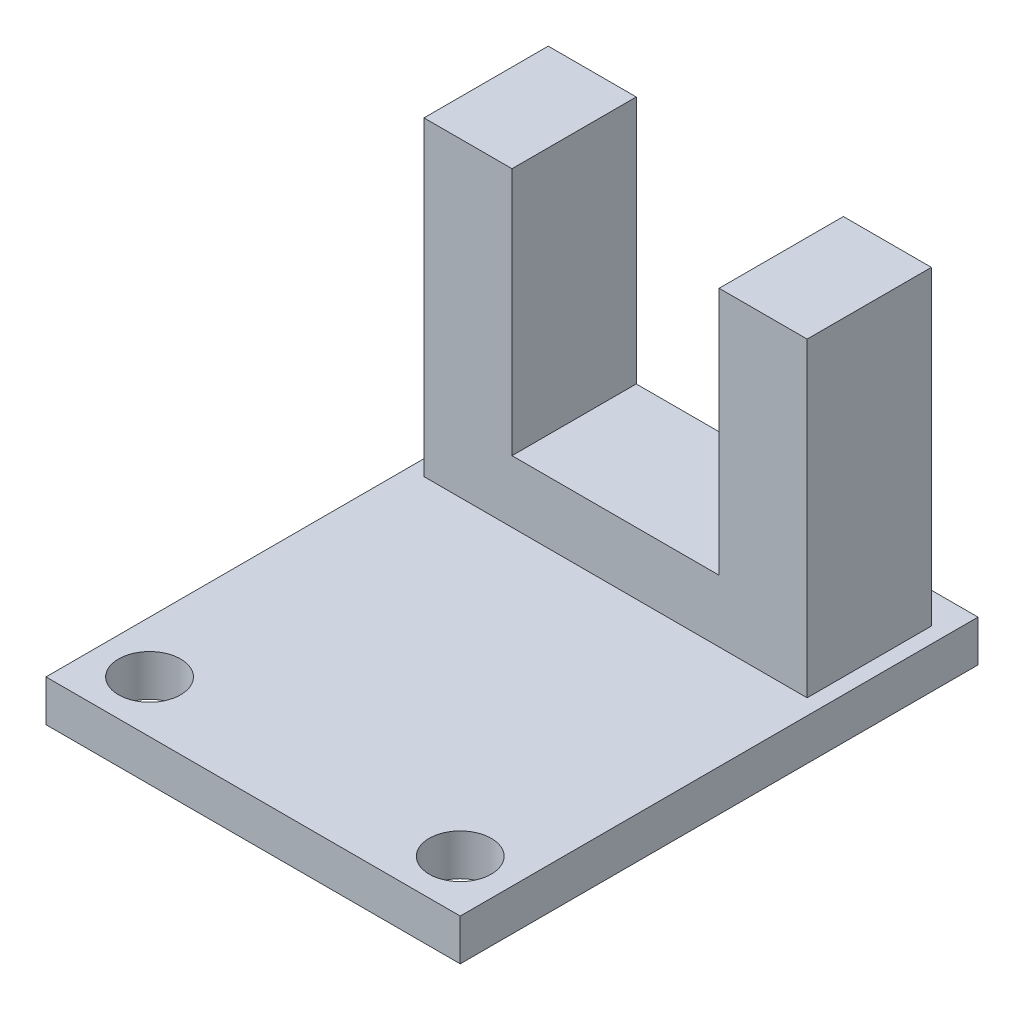
ISO-10303-21;
HEADER;
FILE_DESCRIPTION(('STEP AP214'),'2;1');
FILE_NAME('part.step','',(''),(''),'','','');
FILE_SCHEMA(('AUTOMOTIVE_DESIGN { 1 0 10303 214 1 1 1 1 }'));
ENDSEC;
DATA;
#1=APPLICATION_CONTEXT('core data for automotive mechanical design processes');
#2=APPLICATION_PROTOCOL_DEFINITION('international standard','automotive_design',2000,#1);
#3=PRODUCT_CONTEXT('',#1,'mechanical');
#4=PRODUCT('Part','Part','',(#3));
#5=PRODUCT_RELATED_PRODUCT_CATEGORY('part','',(#4));
#6=PRODUCT_DEFINITION_FORMATION('','',#4);
#7=PRODUCT_DEFINITION_CONTEXT('part definition',#1,'design');
#8=PRODUCT_DEFINITION('design','',#6,#7);
#9=PRODUCT_DEFINITION_SHAPE('','',#8);
#10=(LENGTH_UNIT() NAMED_UNIT(*) SI_UNIT(.MILLI.,.METRE.));
#11=(NAMED_UNIT(*) PLANE_ANGLE_UNIT() SI_UNIT($,.RADIAN.));
#12=(NAMED_UNIT(*) SI_UNIT($,.STERADIAN.) SOLID_ANGLE_UNIT());
#13=UNCERTAINTY_MEASURE_WITH_UNIT(LENGTH_MEASURE(1.E-05),#10,'distance_accuracy_value','');
#14=(GEOMETRIC_REPRESENTATION_CONTEXT(3) GLOBAL_UNCERTAINTY_ASSIGNED_CONTEXT((#13)) GLOBAL_UNIT_ASSIGNED_CONTEXT((#10,
#11,#12)) REPRESENTATION_CONTEXT('',''));
#15=CARTESIAN_POINT('',(0.,0.,0.));
#16=DIRECTION('',(0.,0.,1.));
#17=DIRECTION('',(1.,0.,0.));
#18=AXIS2_PLACEMENT_3D('',#15,#16,#17);
#19=CARTESIAN_POINT('',(0.,15.,0.));
#20=DIRECTION('',(0.,-1.,0.));
#21=DIRECTION('',(0.,0.,-1.));
#22=AXIS2_PLACEMENT_3D('',#19,#20,#21);
#23=PLANE('',#22);
#24=DIRECTION('',(1.,0.,0.));
#25=VECTOR('',#24,1.);
#26=CARTESIAN_POINT('',(9.25,15.,6.));
#27=LINE('',#26,#25);
#28=CARTESIAN_POINT('',(-9.25,15.,6.));
#29=VERTEX_POINT('',#28);
#30=CARTESIAN_POINT('',(-5.,15.,6.));
#31=VERTEX_POINT('',#30);
#32=EDGE_CURVE('E152',#29,#31,#27,.T.);
#33=ORIENTED_EDGE('',*,*,#32,.T.);
#34=DIRECTION('',(0.,0.,-1.));
#35=VECTOR('',#34,1.);
#36=CARTESIAN_POINT('',(-5.,15.,0.));
#37=LINE('',#36,#35);
#38=CARTESIAN_POINT('',(-5.,15.,0.));
#39=VERTEX_POINT('',#38);
#40=EDGE_CURVE('E52',#31,#39,#37,.T.);
#41=ORIENTED_EDGE('',*,*,#40,.T.);
#42=DIRECTION('',(-1.,0.,0.));
#43=VECTOR('',#42,1.);
#44=CARTESIAN_POINT('',(-9.25,15.,0.));
#45=LINE('',#44,#43);
#46=CARTESIAN_POINT('',(-9.25,15.,0.));
#47=VERTEX_POINT('',#46);
#48=EDGE_CURVE('E149',#39,#47,#45,.T.);
#49=ORIENTED_EDGE('',*,*,#48,.T.);
#50=DIRECTION('',(0.,0.,1.));
#51=VECTOR('',#50,1.);
#52=CARTESIAN_POINT('',(-9.25,15.,6.));
#53=LINE('',#52,#51);
#54=EDGE_CURVE('E166',#47,#29,#53,.T.);
#55=ORIENTED_EDGE('',*,*,#54,.T.);
#56=EDGE_LOOP('',(#33,#41,#49,#55));
#57=FACE_BOUND('',#56,.T.);
#58=ADVANCED_FACE('F43',(#57),#23,.F.);
#59=CARTESIAN_POINT('',(0.,0.,0.));
#60=DIRECTION('',(0.,-1.,0.));
#61=DIRECTION('',(0.,0.,-1.));
#62=AXIS2_PLACEMENT_3D('',#59,#60,#61);
#63=PLANE('',#62);
#64=CARTESIAN_POINT('',(-7.5,0.,21.));
#65=DIRECTION('',(0.,1.,0.));
#66=DIRECTION('',(0.,0.,1.));
#67=AXIS2_PLACEMENT_3D('',#64,#65,#66);
#68=CIRCLE('',#67,1.49999999999999);
#69=CARTESIAN_POINT('',(-7.5,0.,22.5));
#70=VERTEX_POINT('',#69);
#71=EDGE_CURVE('E460',#70,#70,#68,.T.);
#72=ORIENTED_EDGE('',*,*,#71,.F.);
#73=EDGE_LOOP('',(#72));
#74=FACE_BOUND('',#73,.T.);
#75=CARTESIAN_POINT('',(7.5,0.,21.));
#76=DIRECTION('',(0.,1.,0.));
#77=DIRECTION('',(0.,0.,1.));
#78=AXIS2_PLACEMENT_3D('',#75,#76,#77);
#79=CIRCLE('',#78,1.49999999999999);
#80=CARTESIAN_POINT('',(7.5,0.,22.5));
#81=VERTEX_POINT('',#80);
#82=EDGE_CURVE('E464',#81,#81,#79,.T.);
#83=ORIENTED_EDGE('',*,*,#82,.F.);
#84=EDGE_LOOP('',(#83));
#85=FACE_BOUND('',#84,.T.);
#86=DIRECTION('',(-1.,0.,0.));
#87=VECTOR('',#86,1.);
#88=CARTESIAN_POINT('',(10.,0.,23.5));
#89=LINE('',#88,#87);
#90=CARTESIAN_POINT('',(10.,0.,23.5));
#91=VERTEX_POINT('',#90);
#92=CARTESIAN_POINT('',(-10.,0.,23.5));
#93=VERTEX_POINT('',#92);
#94=EDGE_CURVE('E205',#91,#93,#89,.T.);
#95=ORIENTED_EDGE('',*,*,#94,.F.);
#96=DIRECTION('',(0.,0.,1.));
#97=VECTOR('',#96,1.);
#98=CARTESIAN_POINT('',(10.,0.,-1.5));
#99=LINE('',#98,#97);
#100=CARTESIAN_POINT('',(10.,0.,-1.5));
#101=VERTEX_POINT('',#100);
#102=EDGE_CURVE('E218',#101,#91,#99,.T.);
#103=ORIENTED_EDGE('',*,*,#102,.F.);
#104=DIRECTION('',(1.,0.,0.));
#105=VECTOR('',#104,1.);
#106=CARTESIAN_POINT('',(-10.,0.,-1.5));
#107=LINE('',#106,#105);
#108=CARTESIAN_POINT('',(-10.,0.,-1.5));
#109=VERTEX_POINT('',#108);
#110=EDGE_CURVE('E214',#109,#101,#107,.T.);
#111=ORIENTED_EDGE('',*,*,#110,.F.);
#112=DIRECTION('',(0.,0.,-1.));
#113=VECTOR('',#112,1.);
#114=CARTESIAN_POINT('',(-10.,0.,23.5));
#115=LINE('',#114,#113);
#116=EDGE_CURVE('E209',#93,#109,#115,.T.);
#117=ORIENTED_EDGE('',*,*,#116,.F.);
#118=EDGE_LOOP('',(#95,#103,#111,#117));
#119=FACE_BOUND('',#118,.T.);
#120=DIRECTION('',(-1.,0.,0.));
#121=VECTOR('',#120,1.);
#122=CARTESIAN_POINT('',(-9.25,0.,0.));
#123=LINE('',#122,#121);
#124=CARTESIAN_POINT('',(9.25,0.,0.));
#125=VERTEX_POINT('',#124);
#126=CARTESIAN_POINT('',(-9.25,0.,0.));
#127=VERTEX_POINT('',#126);
#128=EDGE_CURVE('E183',#125,#127,#123,.T.);
#129=ORIENTED_EDGE('',*,*,#128,.F.);
#130=DIRECTION('',(0.,0.,-1.));
#131=VECTOR('',#130,1.);
#132=CARTESIAN_POINT('',(9.25,0.,0.));
#133=LINE('',#132,#131);
#134=CARTESIAN_POINT('',(9.25,0.,6.));
#135=VERTEX_POINT('',#134);
#136=EDGE_CURVE('E161',#135,#125,#133,.T.);
#137=ORIENTED_EDGE('',*,*,#136,.F.);
#138=DIRECTION('',(1.,0.,0.));
#139=VECTOR('',#138,1.);
#140=CARTESIAN_POINT('',(9.25,0.,6.));
#141=LINE('',#140,#139);
#142=CARTESIAN_POINT('',(-9.25,0.,6.));
#143=VERTEX_POINT('',#142);
#144=EDGE_CURVE('E168',#143,#135,#141,.T.);
#145=ORIENTED_EDGE('',*,*,#144,.F.);
#146=DIRECTION('',(0.,0.,1.));
#147=VECTOR('',#146,1.);
#148=CARTESIAN_POINT('',(-9.25,0.,6.));
#149=LINE('',#148,#147);
#150=EDGE_CURVE('E67',#127,#143,#149,.T.);
#151=ORIENTED_EDGE('',*,*,#150,.F.);
#152=EDGE_LOOP('',(#129,#137,#145,#151));
#153=FACE_BOUND('',#152,.T.);
#154=ADVANCED_FACE('F292',(#74,#85,#119,#153),#63,.F.);
#155=CARTESIAN_POINT('',(10.,0.,23.5));
#156=DIRECTION('',(0.,0.,1.));
#157=DIRECTION('',(1.,0.,0.));
#158=AXIS2_PLACEMENT_3D('',#155,#156,#157);
#159=PLANE('',#158);
#160=DIRECTION('',(-1.,0.,0.));
#161=VECTOR('',#160,1.);
#162=CARTESIAN_POINT('',(10.,-2.,23.5));
#163=LINE('',#162,#161);
#164=CARTESIAN_POINT('',(10.,-2.,23.5));
#165=VERTEX_POINT('',#164);
#166=CARTESIAN_POINT('',(-10.,-2.,23.5));
#167=VERTEX_POINT('',#166);
#168=EDGE_CURVE('E204',#165,#167,#163,.T.);
#169=ORIENTED_EDGE('',*,*,#168,.F.);
#170=DIRECTION('',(0.,-1.,0.));
#171=VECTOR('',#170,1.);
#172=CARTESIAN_POINT('',(10.,0.,23.5));
#173=LINE('',#172,#171);
#174=EDGE_CURVE('E237',#91,#165,#173,.T.);
#175=ORIENTED_EDGE('',*,*,#174,.F.);
#176=ORIENTED_EDGE('',*,*,#94,.T.);
#177=DIRECTION('',(0.,-1.,0.));
#178=VECTOR('',#177,1.);
#179=CARTESIAN_POINT('',(-10.,0.,23.5));
#180=LINE('',#179,#178);
#181=EDGE_CURVE('E222',#93,#167,#180,.T.);
#182=ORIENTED_EDGE('',*,*,#181,.T.);
#183=EDGE_LOOP('',(#169,#175,#176,#182));
#184=FACE_BOUND('',#183,.T.);
#185=ADVANCED_FACE('F45',(#184),#159,.T.);
#186=CARTESIAN_POINT('',(10.,0.,-1.5));
#187=DIRECTION('',(1.,0.,0.));
#188=DIRECTION('',(0.,0.,-1.));
#189=AXIS2_PLACEMENT_3D('',#186,#187,#188);
#190=PLANE('',#189);
#191=DIRECTION('',(0.,0.,1.));
#192=VECTOR('',#191,1.);
#193=CARTESIAN_POINT('',(10.,-2.,-1.5));
#194=LINE('',#193,#192);
#195=CARTESIAN_POINT('',(10.,-2.,-1.5));
#196=VERTEX_POINT('',#195);
#197=EDGE_CURVE('E210',#196,#165,#194,.T.);
#198=ORIENTED_EDGE('',*,*,#197,.F.);
#199=DIRECTION('',(0.,-1.,0.));
#200=VECTOR('',#199,1.);
#201=CARTESIAN_POINT('',(10.,0.,-1.5));
#202=LINE('',#201,#200);
#203=EDGE_CURVE('E240',#101,#196,#202,.T.);
#204=ORIENTED_EDGE('',*,*,#203,.F.);
#205=ORIENTED_EDGE('',*,*,#102,.T.);
#206=ORIENTED_EDGE('',*,*,#174,.T.);
#207=EDGE_LOOP('',(#198,#204,#205,#206));
#208=FACE_BOUND('',#207,.T.);
#209=ADVANCED_FACE('F321',(#208),#190,.T.);
#210=CARTESIAN_POINT('',(-10.,0.,-1.5));
#211=DIRECTION('',(0.,0.,-1.));
#212=DIRECTION('',(-1.,0.,0.));
#213=AXIS2_PLACEMENT_3D('',#210,#211,#212);
#214=PLANE('',#213);
#215=DIRECTION('',(1.,0.,0.));
#216=VECTOR('',#215,1.);
#217=CARTESIAN_POINT('',(-10.,-2.,-1.5));
#218=LINE('',#217,#216);
#219=CARTESIAN_POINT('',(-10.,-2.,-1.5));
#220=VERTEX_POINT('',#219);
#221=EDGE_CURVE('E230',#220,#196,#218,.T.);
#222=ORIENTED_EDGE('',*,*,#221,.F.);
#223=DIRECTION('',(0.,-1.,0.));
#224=VECTOR('',#223,1.);
#225=CARTESIAN_POINT('',(-10.,0.,-1.5));
#226=LINE('',#225,#224);
#227=EDGE_CURVE('E243',#109,#220,#226,.T.);
#228=ORIENTED_EDGE('',*,*,#227,.F.);
#229=ORIENTED_EDGE('',*,*,#110,.T.);
#230=ORIENTED_EDGE('',*,*,#203,.T.);
#231=EDGE_LOOP('',(#222,#228,#229,#230));
#232=FACE_BOUND('',#231,.T.);
#233=ADVANCED_FACE('F324',(#232),#214,.T.);
#234=CARTESIAN_POINT('',(-10.,0.,23.5));
#235=DIRECTION('',(-1.,0.,0.));
#236=DIRECTION('',(0.,0.,1.));
#237=AXIS2_PLACEMENT_3D('',#234,#235,#236);
#238=PLANE('',#237);
#239=DIRECTION('',(0.,0.,-1.));
#240=VECTOR('',#239,1.);
#241=CARTESIAN_POINT('',(-10.,-2.,23.5));
#242=LINE('',#241,#240);
#243=EDGE_CURVE('E226',#167,#220,#242,.T.);
#244=ORIENTED_EDGE('',*,*,#243,.F.);
#245=ORIENTED_EDGE('',*,*,#181,.F.);
#246=ORIENTED_EDGE('',*,*,#116,.T.);
#247=ORIENTED_EDGE('',*,*,#227,.T.);
#248=EDGE_LOOP('',(#244,#245,#246,#247));
#249=FACE_BOUND('',#248,.T.);
#250=ADVANCED_FACE('F319',(#249),#238,.T.);
#251=CARTESIAN_POINT('',(0.,-2.,0.));
#252=DIRECTION('',(0.,-1.,0.));
#253=DIRECTION('',(0.,0.,-1.));
#254=AXIS2_PLACEMENT_3D('',#251,#252,#253);
#255=PLANE('',#254);
#256=CARTESIAN_POINT('',(-7.5,-2.,21.));
#257=DIRECTION('',(0.,1.,0.));
#258=DIRECTION('',(0.,0.,1.));
#259=AXIS2_PLACEMENT_3D('',#256,#257,#258);
#260=CIRCLE('',#259,1.49999999999999);
#261=CARTESIAN_POINT('',(-7.5,-2.,22.5));
#262=VERTEX_POINT('',#261);
#263=EDGE_CURVE('E457',#262,#262,#260,.T.);
#264=ORIENTED_EDGE('',*,*,#263,.T.);
#265=EDGE_LOOP('',(#264));
#266=FACE_BOUND('',#265,.T.);
#267=CARTESIAN_POINT('',(7.5,-2.,21.));
#268=DIRECTION('',(0.,1.,0.));
#269=DIRECTION('',(0.,0.,1.));
#270=AXIS2_PLACEMENT_3D('',#267,#268,#269);
#271=CIRCLE('',#270,1.49999999999999);
#272=CARTESIAN_POINT('',(7.5,-2.,22.5));
#273=VERTEX_POINT('',#272);
#274=EDGE_CURVE('E145',#273,#273,#271,.T.);
#275=ORIENTED_EDGE('',*,*,#274,.T.);
#276=EDGE_LOOP('',(#275));
#277=FACE_BOUND('',#276,.T.);
#278=ORIENTED_EDGE('',*,*,#168,.T.);
#279=ORIENTED_EDGE('',*,*,#243,.T.);
#280=ORIENTED_EDGE('',*,*,#221,.T.);
#281=ORIENTED_EDGE('',*,*,#197,.T.);
#282=EDGE_LOOP('',(#278,#279,#280,#281));
#283=FACE_BOUND('',#282,.T.);
#284=ADVANCED_FACE('F315',(#266,#277,#283),#255,.T.);
#285=CARTESIAN_POINT('',(-9.25,15.,0.));
#286=DIRECTION('',(0.,0.,1.));
#287=DIRECTION('',(1.,0.,0.));
#288=AXIS2_PLACEMENT_3D('',#285,#286,#287);
#289=PLANE('',#288);
#290=ORIENTED_EDGE('',*,*,#48,.F.);
#291=DIRECTION('',(0.,1.,0.));
#292=VECTOR('',#291,1.);
#293=CARTESIAN_POINT('',(-5.,3.,0.));
#294=LINE('',#293,#292);
#295=CARTESIAN_POINT('',(-5.,3.,0.));
#296=VERTEX_POINT('',#295);
#297=EDGE_CURVE('E133',#296,#39,#294,.T.);
#298=ORIENTED_EDGE('',*,*,#297,.F.);
#299=DIRECTION('',(-1.,0.,0.));
#300=VECTOR('',#299,1.);
#301=CARTESIAN_POINT('',(5.,3.,0.));
#302=LINE('',#301,#300);
#303=CARTESIAN_POINT('',(5.,3.,0.));
#304=VERTEX_POINT('',#303);
#305=EDGE_CURVE('E263',#304,#296,#302,.T.);
#306=ORIENTED_EDGE('',*,*,#305,.F.);
#307=DIRECTION('',(0.,-1.,0.));
#308=VECTOR('',#307,1.);
#309=CARTESIAN_POINT('',(5.,15.,0.));
#310=LINE('',#309,#308);
#311=CARTESIAN_POINT('',(5.,15.,0.));
#312=VERTEX_POINT('',#311);
#313=EDGE_CURVE('E144',#312,#304,#310,.T.);
#314=ORIENTED_EDGE('',*,*,#313,.F.);
#315=CARTESIAN_POINT('',(9.25,15.,0.));
#316=VERTEX_POINT('',#315);
#317=EDGE_CURVE('E160',#316,#312,#45,.T.);
#318=ORIENTED_EDGE('',*,*,#317,.F.);
#319=DIRECTION('',(0.,-1.,0.));
#320=VECTOR('',#319,1.);
#321=CARTESIAN_POINT('',(9.25,15.,0.));
#322=LINE('',#321,#320);
#323=EDGE_CURVE('E182',#316,#125,#322,.T.);
#324=ORIENTED_EDGE('',*,*,#323,.T.);
#325=ORIENTED_EDGE('',*,*,#128,.T.);
#326=DIRECTION('',(0.,-1.,0.));
#327=VECTOR('',#326,1.);
#328=CARTESIAN_POINT('',(-9.25,15.,0.));
#329=LINE('',#328,#327);
#330=EDGE_CURVE('E158',#47,#127,#329,.T.);
#331=ORIENTED_EDGE('',*,*,#330,.F.);
#332=EDGE_LOOP('',(#290,#298,#306,#314,#318,#324,#325,#331));
#333=FACE_BOUND('',#332,.T.);
#334=ADVANCED_FACE('F156',(#333),#289,.F.);
#335=CARTESIAN_POINT('',(-9.25,15.,6.));
#336=DIRECTION('',(1.,0.,0.));
#337=DIRECTION('',(0.,0.,-1.));
#338=AXIS2_PLACEMENT_3D('',#335,#336,#337);
#339=PLANE('',#338);
#340=ORIENTED_EDGE('',*,*,#150,.T.);
#341=DIRECTION('',(0.,-1.,0.));
#342=VECTOR('',#341,1.);
#343=CARTESIAN_POINT('',(-9.25,15.,6.));
#344=LINE('',#343,#342);
#345=EDGE_CURVE('E198',#29,#143,#344,.T.);
#346=ORIENTED_EDGE('',*,*,#345,.F.);
#347=ORIENTED_EDGE('',*,*,#54,.F.);
#348=ORIENTED_EDGE('',*,*,#330,.T.);
#349=EDGE_LOOP('',(#340,#346,#347,#348));
#350=FACE_BOUND('',#349,.T.);
#351=ADVANCED_FACE('F308',(#350),#339,.F.);
#352=CARTESIAN_POINT('',(9.25,15.,6.));
#353=DIRECTION('',(0.,0.,-1.));
#354=DIRECTION('',(-1.,0.,0.));
#355=AXIS2_PLACEMENT_3D('',#352,#353,#354);
#356=PLANE('',#355);
#357=DIRECTION('',(-1.,0.,0.));
#358=VECTOR('',#357,1.);
#359=CARTESIAN_POINT('',(9.25,3.,6.));
#360=LINE('',#359,#358);
#361=CARTESIAN_POINT('',(5.,3.,6.));
#362=VERTEX_POINT('',#361);
#363=CARTESIAN_POINT('',(-5.,3.,6.));
#364=VERTEX_POINT('',#363);
#365=EDGE_CURVE('E11',#362,#364,#360,.T.);
#366=ORIENTED_EDGE('',*,*,#365,.T.);
#367=DIRECTION('',(0.,1.,0.));
#368=VECTOR('',#367,1.);
#369=CARTESIAN_POINT('',(-5.,15.,6.));
#370=LINE('',#369,#368);
#371=EDGE_CURVE('E172',#364,#31,#370,.T.);
#372=ORIENTED_EDGE('',*,*,#371,.T.);
#373=ORIENTED_EDGE('',*,*,#32,.F.);
#374=ORIENTED_EDGE('',*,*,#345,.T.);
#375=ORIENTED_EDGE('',*,*,#144,.T.);
#376=DIRECTION('',(0.,-1.,0.));
#377=VECTOR('',#376,1.);
#378=CARTESIAN_POINT('',(9.25,15.,6.));
#379=LINE('',#378,#377);
#380=CARTESIAN_POINT('',(9.25,15.,6.));
#381=VERTEX_POINT('',#380);
#382=EDGE_CURVE('E194',#381,#135,#379,.T.);
#383=ORIENTED_EDGE('',*,*,#382,.F.);
#384=CARTESIAN_POINT('',(5.,15.,6.));
#385=VERTEX_POINT('',#384);
#386=EDGE_CURVE('E176',#385,#381,#27,.T.);
#387=ORIENTED_EDGE('',*,*,#386,.F.);
#388=DIRECTION('',(0.,-1.,0.));
#389=VECTOR('',#388,1.);
#390=CARTESIAN_POINT('',(5.,15.,6.));
#391=LINE('',#390,#389);
#392=EDGE_CURVE('E59',#385,#362,#391,.T.);
#393=ORIENTED_EDGE('',*,*,#392,.T.);
#394=EDGE_LOOP('',(#366,#372,#373,#374,#375,#383,#387,#393));
#395=FACE_BOUND('',#394,.T.);
#396=ADVANCED_FACE('F257',(#395),#356,.F.);
#397=CARTESIAN_POINT('',(9.25,15.,0.));
#398=DIRECTION('',(-1.,0.,0.));
#399=DIRECTION('',(0.,0.,1.));
#400=AXIS2_PLACEMENT_3D('',#397,#398,#399);
#401=PLANE('',#400);
#402=ORIENTED_EDGE('',*,*,#136,.T.);
#403=ORIENTED_EDGE('',*,*,#323,.F.);
#404=DIRECTION('',(0.,0.,-1.));
#405=VECTOR('',#404,1.);
#406=CARTESIAN_POINT('',(9.25,15.,0.));
#407=LINE('',#406,#405);
#408=EDGE_CURVE('E179',#381,#316,#407,.T.);
#409=ORIENTED_EDGE('',*,*,#408,.F.);
#410=ORIENTED_EDGE('',*,*,#382,.T.);
#411=EDGE_LOOP('',(#402,#403,#409,#410));
#412=FACE_BOUND('',#411,.T.);
#413=ADVANCED_FACE('F262',(#412),#401,.F.);
#414=ORIENTED_EDGE('',*,*,#317,.T.);
#415=DIRECTION('',(0.,0.,1.));
#416=VECTOR('',#415,1.);
#417=CARTESIAN_POINT('',(5.,15.,0.));
#418=LINE('',#417,#416);
#419=EDGE_CURVE('E154',#312,#385,#418,.T.);
#420=ORIENTED_EDGE('',*,*,#419,.T.);
#421=ORIENTED_EDGE('',*,*,#386,.T.);
#422=ORIENTED_EDGE('',*,*,#408,.T.);
#423=EDGE_LOOP('',(#414,#420,#421,#422));
#424=FACE_BOUND('',#423,.T.);
#425=ADVANCED_FACE('F251',(#424),#23,.F.);
#426=CARTESIAN_POINT('',(5.,3.,23.5));
#427=DIRECTION('',(0.,-1.,0.));
#428=DIRECTION('',(0.,0.,-1.));
#429=AXIS2_PLACEMENT_3D('',#426,#427,#428);
#430=PLANE('',#429);
#431=DIRECTION('',(0.,0.,-1.));
#432=VECTOR('',#431,1.);
#433=CARTESIAN_POINT('',(5.,3.,23.5));
#434=LINE('',#433,#432);
#435=EDGE_CURVE('E267',#362,#304,#434,.T.);
#436=ORIENTED_EDGE('',*,*,#435,.T.);
#437=ORIENTED_EDGE('',*,*,#305,.T.);
#438=DIRECTION('',(0.,0.,-1.));
#439=VECTOR('',#438,1.);
#440=CARTESIAN_POINT('',(-5.,3.,23.5));
#441=LINE('',#440,#439);
#442=EDGE_CURVE('E138',#364,#296,#441,.T.);
#443=ORIENTED_EDGE('',*,*,#442,.F.);
#444=ORIENTED_EDGE('',*,*,#365,.F.);
#445=EDGE_LOOP('',(#436,#437,#443,#444));
#446=FACE_BOUND('',#445,.T.);
#447=ADVANCED_FACE('F277',(#446),#430,.F.);
#448=CARTESIAN_POINT('',(-5.,3.,23.5));
#449=DIRECTION('',(-1.,0.,0.));
#450=DIRECTION('',(0.,0.,1.));
#451=AXIS2_PLACEMENT_3D('',#448,#449,#450);
#452=PLANE('',#451);
#453=ORIENTED_EDGE('',*,*,#442,.T.);
#454=ORIENTED_EDGE('',*,*,#297,.T.);
#455=ORIENTED_EDGE('',*,*,#40,.F.);
#456=ORIENTED_EDGE('',*,*,#371,.F.);
#457=EDGE_LOOP('',(#453,#454,#455,#456));
#458=FACE_BOUND('',#457,.T.);
#459=ADVANCED_FACE('F135',(#458),#452,.F.);
#460=CARTESIAN_POINT('',(5.,15.,23.5));
#461=DIRECTION('',(1.,0.,0.));
#462=DIRECTION('',(0.,0.,-1.));
#463=AXIS2_PLACEMENT_3D('',#460,#461,#462);
#464=PLANE('',#463);
#465=ORIENTED_EDGE('',*,*,#419,.F.);
#466=ORIENTED_EDGE('',*,*,#313,.T.);
#467=ORIENTED_EDGE('',*,*,#435,.F.);
#468=ORIENTED_EDGE('',*,*,#392,.F.);
#469=EDGE_LOOP('',(#465,#466,#467,#468));
#470=FACE_BOUND('',#469,.T.);
#471=ADVANCED_FACE('F278',(#470),#464,.F.);
#472=CARTESIAN_POINT('',(7.5,0.,21.));
#473=DIRECTION('',(0.,1.,0.));
#474=DIRECTION('',(0.,0.,1.));
#475=AXIS2_PLACEMENT_3D('',#472,#473,#474);
#476=CYLINDRICAL_SURFACE('',#475,1.49999999999999);
#477=ORIENTED_EDGE('',*,*,#274,.F.);
#478=EDGE_LOOP('',(#477));
#479=FACE_BOUND('',#478,.T.);
#480=ORIENTED_EDGE('',*,*,#82,.T.);
#481=EDGE_LOOP('',(#480));
#482=FACE_BOUND('',#481,.T.);
#483=ADVANCED_FACE('F280',(#479,#482),#476,.F.);
#484=CARTESIAN_POINT('',(-7.5,0.,21.));
#485=DIRECTION('',(0.,1.,0.));
#486=DIRECTION('',(0.,0.,1.));
#487=AXIS2_PLACEMENT_3D('',#484,#485,#486);
#488=CYLINDRICAL_SURFACE('',#487,1.49999999999999);
#489=ORIENTED_EDGE('',*,*,#263,.F.);
#490=EDGE_LOOP('',(#489));
#491=FACE_BOUND('',#490,.T.);
#492=ORIENTED_EDGE('',*,*,#71,.T.);
#493=EDGE_LOOP('',(#492));
#494=FACE_BOUND('',#493,.T.);
#495=ADVANCED_FACE('F286',(#491,#494),#488,.F.);
#496=CLOSED_SHELL('',(#58,#154,#185,#209,#233,#250,#284,#334,#351,#396,#413,#425,#447,#459,#471,
#483,#495));
#497=MANIFOLD_SOLID_BREP('B2',#496);
#498=ADVANCED_BREP_SHAPE_REPRESENTATION('',(#18,#497),#14);
#499=SHAPE_DEFINITION_REPRESENTATION(#9,#498);
ENDSEC;
END-ISO-10303-21;
